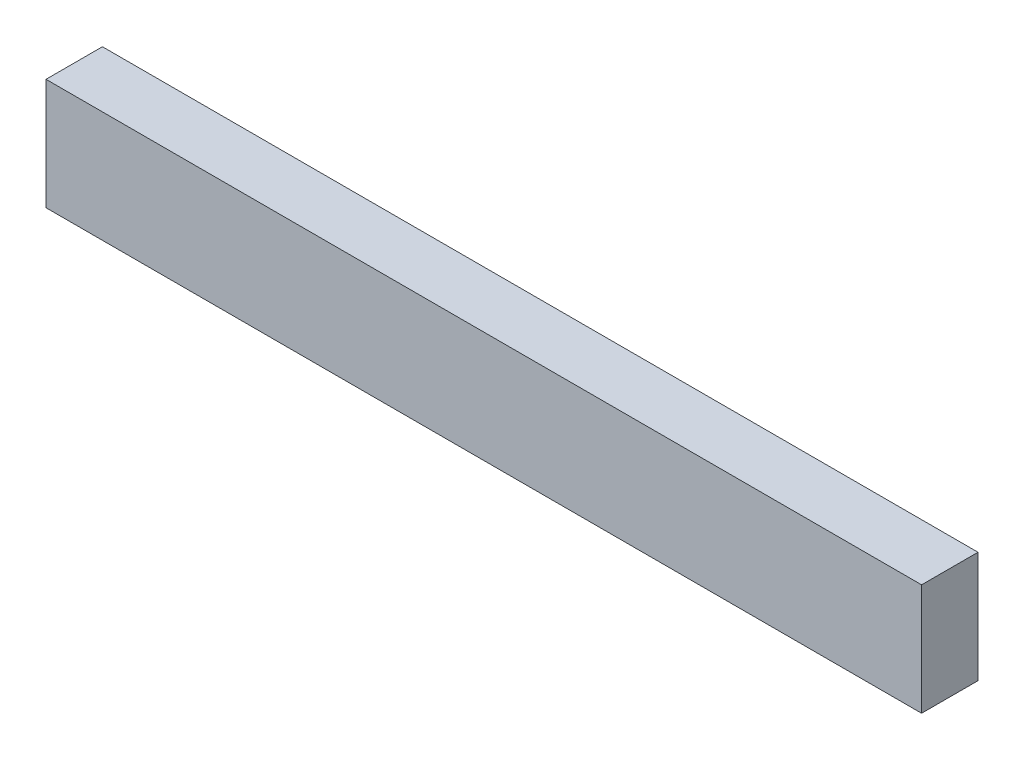
ISO-10303-21;
HEADER;
FILE_DESCRIPTION(('STEP AP214'),'2;1');
FILE_NAME('part.step','',(''),(''),'','','');
FILE_SCHEMA(('AUTOMOTIVE_DESIGN { 1 0 10303 214 1 1 1 1 }'));
ENDSEC;
DATA;
#1=APPLICATION_CONTEXT('core data for automotive mechanical design processes');
#2=APPLICATION_PROTOCOL_DEFINITION('international standard','automotive_design',2000,#1);
#3=PRODUCT_CONTEXT('',#1,'mechanical');
#4=PRODUCT('Part','Part','',(#3));
#5=PRODUCT_RELATED_PRODUCT_CATEGORY('part','',(#4));
#6=PRODUCT_DEFINITION_FORMATION('','',#4);
#7=PRODUCT_DEFINITION_CONTEXT('part definition',#1,'design');
#8=PRODUCT_DEFINITION('design','',#6,#7);
#9=PRODUCT_DEFINITION_SHAPE('','',#8);
#10=(LENGTH_UNIT() NAMED_UNIT(*) SI_UNIT(.MILLI.,.METRE.));
#11=(NAMED_UNIT(*) PLANE_ANGLE_UNIT() SI_UNIT($,.RADIAN.));
#12=(NAMED_UNIT(*) SI_UNIT($,.STERADIAN.) SOLID_ANGLE_UNIT());
#13=UNCERTAINTY_MEASURE_WITH_UNIT(LENGTH_MEASURE(1.E-05),#10,'distance_accuracy_value','');
#14=(GEOMETRIC_REPRESENTATION_CONTEXT(3) GLOBAL_UNCERTAINTY_ASSIGNED_CONTEXT((#13)) GLOBAL_UNIT_ASSIGNED_CONTEXT((#10,
#11,#12)) REPRESENTATION_CONTEXT('',''));
#15=CARTESIAN_POINT('',(0.,0.,0.));
#16=DIRECTION('',(0.,0.,1.));
#17=DIRECTION('',(1.,0.,0.));
#18=AXIS2_PLACEMENT_3D('',#15,#16,#17);
#19=CARTESIAN_POINT('',(19.4,-2.465,2.5));
#20=DIRECTION('',(-1.,0.,0.));
#21=DIRECTION('',(0.,0.,1.));
#22=AXIS2_PLACEMENT_3D('',#19,#20,#21);
#23=PLANE('',#22);
#24=DIRECTION('',(0.,1.,0.));
#25=VECTOR('',#24,1.);
#26=CARTESIAN_POINT('',(19.4,-2.465,0.));
#27=LINE('',#26,#25);
#28=CARTESIAN_POINT('',(19.4,-2.465,0.));
#29=VERTEX_POINT('',#28);
#30=CARTESIAN_POINT('',(19.4,2.465,0.));
#31=VERTEX_POINT('',#30);
#32=EDGE_CURVE('E95',#29,#31,#27,.T.);
#33=ORIENTED_EDGE('',*,*,#32,.T.);
#34=DIRECTION('',(0.,0.,-1.));
#35=VECTOR('',#34,1.);
#36=CARTESIAN_POINT('',(19.4,2.465,2.5));
#37=LINE('',#36,#35);
#38=CARTESIAN_POINT('',(19.4,2.465,2.5));
#39=VERTEX_POINT('',#38);
#40=EDGE_CURVE('E11',#39,#31,#37,.T.);
#41=ORIENTED_EDGE('',*,*,#40,.F.);
#42=DIRECTION('',(0.,1.,0.));
#43=VECTOR('',#42,1.);
#44=CARTESIAN_POINT('',(19.4,-2.465,2.5));
#45=LINE('',#44,#43);
#46=CARTESIAN_POINT('',(19.4,-2.465,2.5));
#47=VERTEX_POINT('',#46);
#48=EDGE_CURVE('E83',#47,#39,#45,.T.);
#49=ORIENTED_EDGE('',*,*,#48,.F.);
#50=DIRECTION('',(0.,0.,-1.));
#51=VECTOR('',#50,1.);
#52=CARTESIAN_POINT('',(19.4,-2.465,2.5));
#53=LINE('',#52,#51);
#54=EDGE_CURVE('E91',#47,#29,#53,.T.);
#55=ORIENTED_EDGE('',*,*,#54,.T.);
#56=EDGE_LOOP('',(#33,#41,#49,#55));
#57=FACE_BOUND('',#56,.T.);
#58=ADVANCED_FACE('F32',(#57),#23,.F.);
#59=CARTESIAN_POINT('',(-19.4,2.465,2.5));
#60=DIRECTION('',(0.,-1.,0.));
#61=DIRECTION('',(0.,0.,-1.));
#62=AXIS2_PLACEMENT_3D('',#59,#60,#61);
#63=PLANE('',#62);
#64=DIRECTION('',(-1.,0.,0.));
#65=VECTOR('',#64,1.);
#66=CARTESIAN_POINT('',(-19.4,2.465,0.));
#67=LINE('',#66,#65);
#68=CARTESIAN_POINT('',(-19.4,2.465,0.));
#69=VERTEX_POINT('',#68);
#70=EDGE_CURVE('E87',#31,#69,#67,.T.);
#71=ORIENTED_EDGE('',*,*,#70,.T.);
#72=DIRECTION('',(0.,0.,-1.));
#73=VECTOR('',#72,1.);
#74=CARTESIAN_POINT('',(-19.4,2.465,2.5));
#75=LINE('',#74,#73);
#76=CARTESIAN_POINT('',(-19.4,2.465,2.5));
#77=VERTEX_POINT('',#76);
#78=EDGE_CURVE('E40',#77,#69,#75,.T.);
#79=ORIENTED_EDGE('',*,*,#78,.F.);
#80=DIRECTION('',(-1.,0.,0.));
#81=VECTOR('',#80,1.);
#82=CARTESIAN_POINT('',(-19.4,2.465,2.5));
#83=LINE('',#82,#81);
#84=EDGE_CURVE('E78',#39,#77,#83,.T.);
#85=ORIENTED_EDGE('',*,*,#84,.F.);
#86=ORIENTED_EDGE('',*,*,#40,.T.);
#87=EDGE_LOOP('',(#71,#79,#85,#86));
#88=FACE_BOUND('',#87,.T.);
#89=ADVANCED_FACE('F86',(#88),#63,.F.);
#90=CARTESIAN_POINT('',(-19.4,-2.465,2.5));
#91=DIRECTION('',(1.,0.,0.));
#92=DIRECTION('',(0.,0.,-1.));
#93=AXIS2_PLACEMENT_3D('',#90,#91,#92);
#94=PLANE('',#93);
#95=DIRECTION('',(0.,-1.,0.));
#96=VECTOR('',#95,1.);
#97=CARTESIAN_POINT('',(-19.4,-2.465,0.));
#98=LINE('',#97,#96);
#99=CARTESIAN_POINT('',(-19.4,-2.465,0.));
#100=VERTEX_POINT('',#99);
#101=EDGE_CURVE('E65',#69,#100,#98,.T.);
#102=ORIENTED_EDGE('',*,*,#101,.T.);
#103=DIRECTION('',(0.,0.,-1.));
#104=VECTOR('',#103,1.);
#105=CARTESIAN_POINT('',(-19.4,-2.465,2.5));
#106=LINE('',#105,#104);
#107=CARTESIAN_POINT('',(-19.4,-2.465,2.5));
#108=VERTEX_POINT('',#107);
#109=EDGE_CURVE('E88',#108,#100,#106,.T.);
#110=ORIENTED_EDGE('',*,*,#109,.F.);
#111=DIRECTION('',(0.,-1.,0.));
#112=VECTOR('',#111,1.);
#113=CARTESIAN_POINT('',(-19.4,-2.465,2.5));
#114=LINE('',#113,#112);
#115=EDGE_CURVE('E81',#77,#108,#114,.T.);
#116=ORIENTED_EDGE('',*,*,#115,.F.);
#117=ORIENTED_EDGE('',*,*,#78,.T.);
#118=EDGE_LOOP('',(#102,#110,#116,#117));
#119=FACE_BOUND('',#118,.T.);
#120=ADVANCED_FACE('F89',(#119),#94,.F.);
#121=CARTESIAN_POINT('',(-19.4,-2.465,2.5));
#122=DIRECTION('',(0.,1.,0.));
#123=DIRECTION('',(0.,0.,1.));
#124=AXIS2_PLACEMENT_3D('',#121,#122,#123);
#125=PLANE('',#124);
#126=DIRECTION('',(1.,0.,0.));
#127=VECTOR('',#126,1.);
#128=CARTESIAN_POINT('',(-19.4,-2.465,0.));
#129=LINE('',#128,#127);
#130=EDGE_CURVE('E71',#100,#29,#129,.T.);
#131=ORIENTED_EDGE('',*,*,#130,.T.);
#132=ORIENTED_EDGE('',*,*,#54,.F.);
#133=DIRECTION('',(1.,0.,0.));
#134=VECTOR('',#133,1.);
#135=CARTESIAN_POINT('',(-19.4,-2.465,2.5));
#136=LINE('',#135,#134);
#137=EDGE_CURVE('E48',#108,#47,#136,.T.);
#138=ORIENTED_EDGE('',*,*,#137,.F.);
#139=ORIENTED_EDGE('',*,*,#109,.T.);
#140=EDGE_LOOP('',(#131,#132,#138,#139));
#141=FACE_BOUND('',#140,.T.);
#142=ADVANCED_FACE('F102',(#141),#125,.F.);
#143=CARTESIAN_POINT('',(0.,0.,2.5));
#144=DIRECTION('',(0.,0.,-1.));
#145=DIRECTION('',(-1.,0.,0.));
#146=AXIS2_PLACEMENT_3D('',#143,#144,#145);
#147=PLANE('',#146);
#148=ORIENTED_EDGE('',*,*,#48,.T.);
#149=ORIENTED_EDGE('',*,*,#84,.T.);
#150=ORIENTED_EDGE('',*,*,#115,.T.);
#151=ORIENTED_EDGE('',*,*,#137,.T.);
#152=EDGE_LOOP('',(#148,#149,#150,#151));
#153=FACE_BOUND('',#152,.T.);
#154=ADVANCED_FACE('F79',(#153),#147,.F.);
#155=CARTESIAN_POINT('',(0.,0.,0.));
#156=DIRECTION('',(0.,0.,-1.));
#157=DIRECTION('',(-1.,0.,0.));
#158=AXIS2_PLACEMENT_3D('',#155,#156,#157);
#159=PLANE('',#158);
#160=ORIENTED_EDGE('',*,*,#32,.F.);
#161=ORIENTED_EDGE('',*,*,#130,.F.);
#162=ORIENTED_EDGE('',*,*,#101,.F.);
#163=ORIENTED_EDGE('',*,*,#70,.F.);
#164=EDGE_LOOP('',(#160,#161,#162,#163));
#165=FACE_BOUND('',#164,.T.);
#166=ADVANCED_FACE('F105',(#165),#159,.T.);
#167=CLOSED_SHELL('',(#58,#89,#120,#142,#154,#166));
#168=MANIFOLD_SOLID_BREP('B2',#167);
#169=ADVANCED_BREP_SHAPE_REPRESENTATION('',(#18,#168),#14);
#170=SHAPE_DEFINITION_REPRESENTATION(#9,#169);
ENDSEC;
END-ISO-10303-21;
